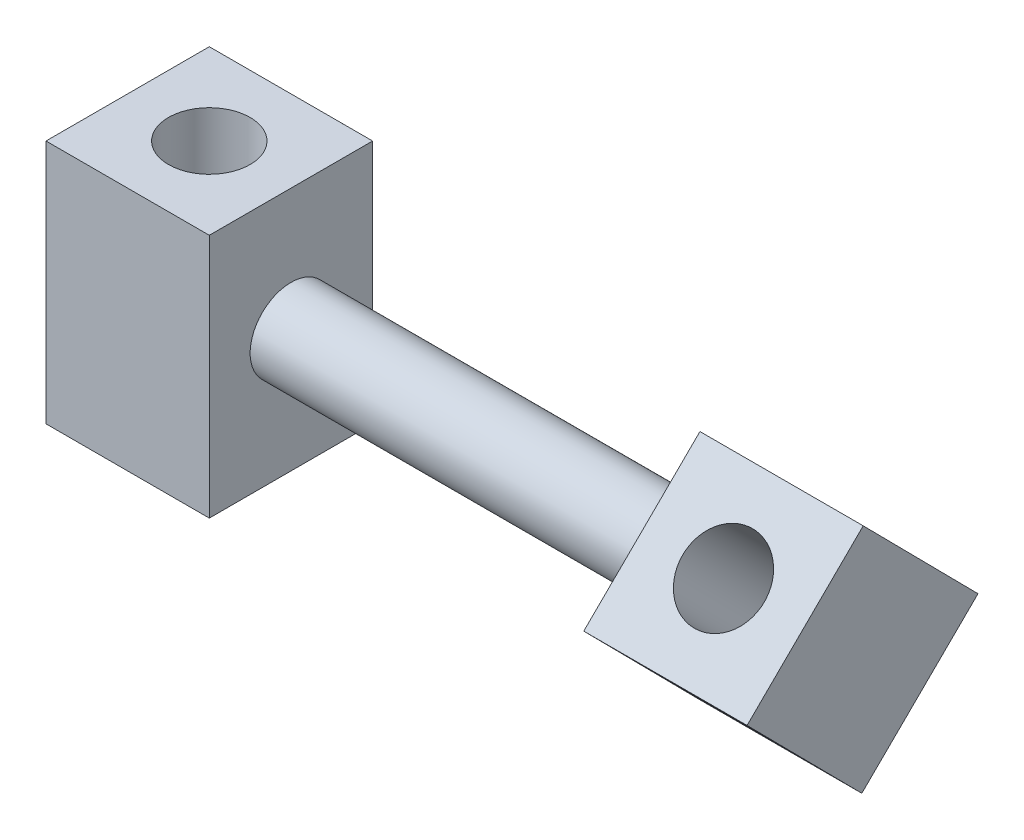
ISO-10303-21;
HEADER;
FILE_DESCRIPTION(('STEP AP214'),'2;1');
FILE_NAME('part.step','',(''),(''),'','','');
FILE_SCHEMA(('AUTOMOTIVE_DESIGN { 1 0 10303 214 1 1 1 1 }'));
ENDSEC;
DATA;
#1=APPLICATION_CONTEXT('core data for automotive mechanical design processes');
#2=APPLICATION_PROTOCOL_DEFINITION('international standard','automotive_design',2000,#1);
#3=PRODUCT_CONTEXT('',#1,'mechanical');
#4=PRODUCT('Part','Part','',(#3));
#5=PRODUCT_RELATED_PRODUCT_CATEGORY('part','',(#4));
#6=PRODUCT_DEFINITION_FORMATION('','',#4);
#7=PRODUCT_DEFINITION_CONTEXT('part definition',#1,'design');
#8=PRODUCT_DEFINITION('design','',#6,#7);
#9=PRODUCT_DEFINITION_SHAPE('','',#8);
#10=(LENGTH_UNIT() NAMED_UNIT(*) SI_UNIT(.MILLI.,.METRE.));
#11=(NAMED_UNIT(*) PLANE_ANGLE_UNIT() SI_UNIT($,.RADIAN.));
#12=(NAMED_UNIT(*) SI_UNIT($,.STERADIAN.) SOLID_ANGLE_UNIT());
#13=UNCERTAINTY_MEASURE_WITH_UNIT(LENGTH_MEASURE(1.E-05),#10,'distance_accuracy_value','');
#14=(GEOMETRIC_REPRESENTATION_CONTEXT(3) GLOBAL_UNCERTAINTY_ASSIGNED_CONTEXT((#13)) GLOBAL_UNIT_ASSIGNED_CONTEXT((#10,
#11,#12)) REPRESENTATION_CONTEXT('',''));
#15=CARTESIAN_POINT('',(0.,0.,0.));
#16=DIRECTION('',(0.,0.,1.));
#17=DIRECTION('',(1.,0.,0.));
#18=AXIS2_PLACEMENT_3D('',#15,#16,#17);
#19=CARTESIAN_POINT('',(10.,30.,10.));
#20=DIRECTION('',(-1.,0.,0.));
#21=DIRECTION('',(0.,0.,1.));
#22=AXIS2_PLACEMENT_3D('',#19,#20,#21);
#23=PLANE('',#22);
#24=CARTESIAN_POINT('',(10.,15.,0.));
#25=DIRECTION('',(1.,0.,0.));
#26=DIRECTION('',(0.,0.,-1.));
#27=AXIS2_PLACEMENT_3D('',#24,#25,#26);
#28=CIRCLE('',#27,5.);
#29=CARTESIAN_POINT('',(10.,15.,-5.));
#30=VERTEX_POINT('',#29);
#31=EDGE_CURVE('E11',#30,#30,#28,.T.);
#32=ORIENTED_EDGE('',*,*,#31,.F.);
#33=EDGE_LOOP('',(#32));
#34=FACE_BOUND('',#33,.T.);
#35=DIRECTION('',(0.,0.,-1.));
#36=VECTOR('',#35,1.);
#37=CARTESIAN_POINT('',(10.,0.,10.));
#38=LINE('',#37,#36);
#39=CARTESIAN_POINT('',(10.,0.,10.));
#40=VERTEX_POINT('',#39);
#41=CARTESIAN_POINT('',(10.,0.,-10.));
#42=VERTEX_POINT('',#41);
#43=EDGE_CURVE('E138',#40,#42,#38,.T.);
#44=ORIENTED_EDGE('',*,*,#43,.T.);
#45=DIRECTION('',(0.,-1.,0.));
#46=VECTOR('',#45,1.);
#47=CARTESIAN_POINT('',(10.,30.,-10.));
#48=LINE('',#47,#46);
#49=CARTESIAN_POINT('',(10.,30.,-10.));
#50=VERTEX_POINT('',#49);
#51=EDGE_CURVE('E37',#50,#42,#48,.T.);
#52=ORIENTED_EDGE('',*,*,#51,.F.);
#53=DIRECTION('',(0.,0.,-1.));
#54=VECTOR('',#53,1.);
#55=CARTESIAN_POINT('',(10.,30.,10.));
#56=LINE('',#55,#54);
#57=CARTESIAN_POINT('',(10.,30.,10.));
#58=VERTEX_POINT('',#57);
#59=EDGE_CURVE('E144',#58,#50,#56,.T.);
#60=ORIENTED_EDGE('',*,*,#59,.F.);
#61=DIRECTION('',(0.,-1.,0.));
#62=VECTOR('',#61,1.);
#63=CARTESIAN_POINT('',(10.,30.,10.));
#64=LINE('',#63,#62);
#65=EDGE_CURVE('E150',#58,#40,#64,.T.);
#66=ORIENTED_EDGE('',*,*,#65,.T.);
#67=EDGE_LOOP('',(#44,#52,#60,#66));
#68=FACE_BOUND('',#67,.T.);
#69=ADVANCED_FACE('F34',(#34,#68),#23,.F.);
#70=CARTESIAN_POINT('',(-10.,30.,-10.));
#71=DIRECTION('',(0.,0.,1.));
#72=DIRECTION('',(1.,0.,0.));
#73=AXIS2_PLACEMENT_3D('',#70,#71,#72);
#74=PLANE('',#73);
#75=DIRECTION('',(-1.,0.,0.));
#76=VECTOR('',#75,1.);
#77=CARTESIAN_POINT('',(-10.,0.,-10.));
#78=LINE('',#77,#76);
#79=CARTESIAN_POINT('',(-10.,0.,-10.));
#80=VERTEX_POINT('',#79);
#81=EDGE_CURVE('E153',#42,#80,#78,.T.);
#82=ORIENTED_EDGE('',*,*,#81,.T.);
#83=DIRECTION('',(0.,-1.,0.));
#84=VECTOR('',#83,1.);
#85=CARTESIAN_POINT('',(-10.,30.,-10.));
#86=LINE('',#85,#84);
#87=CARTESIAN_POINT('',(-10.,30.,-10.));
#88=VERTEX_POINT('',#87);
#89=EDGE_CURVE('E159',#88,#80,#86,.T.);
#90=ORIENTED_EDGE('',*,*,#89,.F.);
#91=DIRECTION('',(-1.,0.,0.));
#92=VECTOR('',#91,1.);
#93=CARTESIAN_POINT('',(-10.,30.,-10.));
#94=LINE('',#93,#92);
#95=EDGE_CURVE('E83',#50,#88,#94,.T.);
#96=ORIENTED_EDGE('',*,*,#95,.F.);
#97=ORIENTED_EDGE('',*,*,#51,.T.);
#98=EDGE_LOOP('',(#82,#90,#96,#97));
#99=FACE_BOUND('',#98,.T.);
#100=ADVANCED_FACE('F162',(#99),#74,.F.);
#101=CARTESIAN_POINT('',(-10.,30.,10.));
#102=DIRECTION('',(1.,0.,0.));
#103=DIRECTION('',(0.,0.,-1.));
#104=AXIS2_PLACEMENT_3D('',#101,#102,#103);
#105=PLANE('',#104);
#106=DIRECTION('',(0.,0.,1.));
#107=VECTOR('',#106,1.);
#108=CARTESIAN_POINT('',(-10.,0.,10.));
#109=LINE('',#108,#107);
#110=CARTESIAN_POINT('',(-10.,0.,10.));
#111=VERTEX_POINT('',#110);
#112=EDGE_CURVE('E69',#80,#111,#109,.T.);
#113=ORIENTED_EDGE('',*,*,#112,.T.);
#114=DIRECTION('',(0.,-1.,0.));
#115=VECTOR('',#114,1.);
#116=CARTESIAN_POINT('',(-10.,30.,10.));
#117=LINE('',#116,#115);
#118=CARTESIAN_POINT('',(-10.,30.,10.));
#119=VERTEX_POINT('',#118);
#120=EDGE_CURVE('E158',#119,#111,#117,.T.);
#121=ORIENTED_EDGE('',*,*,#120,.F.);
#122=DIRECTION('',(0.,0.,1.));
#123=VECTOR('',#122,1.);
#124=CARTESIAN_POINT('',(-10.,30.,10.));
#125=LINE('',#124,#123);
#126=EDGE_CURVE('E147',#88,#119,#125,.T.);
#127=ORIENTED_EDGE('',*,*,#126,.F.);
#128=ORIENTED_EDGE('',*,*,#89,.T.);
#129=EDGE_LOOP('',(#113,#121,#127,#128));
#130=FACE_BOUND('',#129,.T.);
#131=ADVANCED_FACE('F189',(#130),#105,.F.);
#132=CARTESIAN_POINT('',(-10.,30.,10.));
#133=DIRECTION('',(0.,0.,-1.));
#134=DIRECTION('',(-1.,0.,0.));
#135=AXIS2_PLACEMENT_3D('',#132,#133,#134);
#136=PLANE('',#135);
#137=DIRECTION('',(1.,0.,0.));
#138=VECTOR('',#137,1.);
#139=CARTESIAN_POINT('',(-10.,0.,10.));
#140=LINE('',#139,#138);
#141=EDGE_CURVE('E75',#111,#40,#140,.T.);
#142=ORIENTED_EDGE('',*,*,#141,.T.);
#143=ORIENTED_EDGE('',*,*,#65,.F.);
#144=DIRECTION('',(1.,0.,0.));
#145=VECTOR('',#144,1.);
#146=CARTESIAN_POINT('',(-10.,30.,10.));
#147=LINE('',#146,#145);
#148=EDGE_CURVE('E51',#119,#58,#147,.T.);
#149=ORIENTED_EDGE('',*,*,#148,.F.);
#150=ORIENTED_EDGE('',*,*,#120,.T.);
#151=EDGE_LOOP('',(#142,#143,#149,#150));
#152=FACE_BOUND('',#151,.T.);
#153=ADVANCED_FACE('F179',(#152),#136,.F.);
#154=CARTESIAN_POINT('',(0.,30.,0.));
#155=DIRECTION('',(0.,-1.,0.));
#156=DIRECTION('',(0.,0.,-1.));
#157=AXIS2_PLACEMENT_3D('',#154,#155,#156);
#158=PLANE('',#157);
#159=CARTESIAN_POINT('',(0.,30.,0.));
#160=DIRECTION('',(0.,1.,0.));
#161=DIRECTION('',(0.,0.,1.));
#162=AXIS2_PLACEMENT_3D('',#159,#160,#161);
#163=CIRCLE('',#162,5.);
#164=CARTESIAN_POINT('',(0.,30.,5.));
#165=VERTEX_POINT('',#164);
#166=EDGE_CURVE('E326',#165,#165,#163,.T.);
#167=ORIENTED_EDGE('',*,*,#166,.F.);
#168=EDGE_LOOP('',(#167));
#169=FACE_BOUND('',#168,.T.);
#170=ORIENTED_EDGE('',*,*,#59,.T.);
#171=ORIENTED_EDGE('',*,*,#95,.T.);
#172=ORIENTED_EDGE('',*,*,#126,.T.);
#173=ORIENTED_EDGE('',*,*,#148,.T.);
#174=EDGE_LOOP('',(#170,#171,#172,#173));
#175=FACE_BOUND('',#174,.T.);
#176=ADVANCED_FACE('F170',(#169,#175),#158,.F.);
#177=CARTESIAN_POINT('',(0.,0.,0.));
#178=DIRECTION('',(0.,-1.,0.));
#179=DIRECTION('',(0.,0.,-1.));
#180=AXIS2_PLACEMENT_3D('',#177,#178,#179);
#181=PLANE('',#180);
#182=CARTESIAN_POINT('',(0.,0.,0.));
#183=DIRECTION('',(0.,-1.,0.));
#184=DIRECTION('',(0.,0.,-1.));
#185=AXIS2_PLACEMENT_3D('',#182,#183,#184);
#186=CIRCLE('',#185,5.);
#187=CARTESIAN_POINT('',(0.,0.,-5.));
#188=VERTEX_POINT('',#187);
#189=EDGE_CURVE('E328',#188,#188,#186,.F.);
#190=ORIENTED_EDGE('',*,*,#189,.T.);
#191=EDGE_LOOP('',(#190));
#192=FACE_BOUND('',#191,.T.);
#193=ORIENTED_EDGE('',*,*,#43,.F.);
#194=ORIENTED_EDGE('',*,*,#141,.F.);
#195=ORIENTED_EDGE('',*,*,#112,.F.);
#196=ORIENTED_EDGE('',*,*,#81,.F.);
#197=EDGE_LOOP('',(#193,#194,#195,#196));
#198=FACE_BOUND('',#197,.T.);
#199=ADVANCED_FACE('F167',(#192,#198),#181,.T.);
#200=CARTESIAN_POINT('',(60.,15.,0.));
#201=DIRECTION('',(-1.,0.,0.));
#202=DIRECTION('',(0.,0.,1.));
#203=AXIS2_PLACEMENT_3D('',#200,#201,#202);
#204=CYLINDRICAL_SURFACE('',#203,5.);
#205=CARTESIAN_POINT('',(60.,15.,0.));
#206=DIRECTION('',(1.,0.,0.));
#207=DIRECTION('',(0.,0.,-1.));
#208=AXIS2_PLACEMENT_3D('',#205,#206,#207);
#209=CIRCLE('',#208,5.);
#210=CARTESIAN_POINT('',(60.,15.,-5.));
#211=VERTEX_POINT('',#210);
#212=EDGE_CURVE('E135',#211,#211,#209,.T.);
#213=ORIENTED_EDGE('',*,*,#212,.F.);
#214=EDGE_LOOP('',(#213));
#215=FACE_BOUND('',#214,.T.);
#216=ORIENTED_EDGE('',*,*,#31,.T.);
#217=EDGE_LOOP('',(#216));
#218=FACE_BOUND('',#217,.T.);
#219=ADVANCED_FACE('F169',(#215,#218),#204,.T.);
#220=CARTESIAN_POINT('',(80.,15.0855355460684,14.1418769500501));
#221=DIRECTION('',(0.,0.702817070199086,-0.711370624805926));
#222=DIRECTION('',(0.,0.711370624805926,0.702817070199086));
#223=AXIS2_PLACEMENT_3D('',#220,#221,#222);
#224=PLANE('',#223);
#225=DIRECTION('',(0.,-0.711370624805926,-0.702817070199086));
#226=VECTOR('',#225,1.);
#227=CARTESIAN_POINT('',(60.,15.0855355460684,14.1418769500501));
#228=LINE('',#227,#226);
#229=CARTESIAN_POINT('',(60.,15.0855355460684,14.1418769500501));
#230=VERTEX_POINT('',#229);
#231=CARTESIAN_POINT('',(60.,0.858123049949879,0.0855355460683983));
#232=VERTEX_POINT('',#231);
#233=EDGE_CURVE('E134',#230,#232,#228,.T.);
#234=ORIENTED_EDGE('',*,*,#233,.T.);
#235=DIRECTION('',(-1.,0.,0.));
#236=VECTOR('',#235,1.);
#237=CARTESIAN_POINT('',(80.,0.858123049949879,0.0855355460683983));
#238=LINE('',#237,#236);
#239=CARTESIAN_POINT('',(80.,0.858123049949879,0.0855355460683983));
#240=VERTEX_POINT('',#239);
#241=EDGE_CURVE('E114',#240,#232,#238,.T.);
#242=ORIENTED_EDGE('',*,*,#241,.F.);
#243=DIRECTION('',(0.,-0.711370624805926,-0.702817070199086));
#244=VECTOR('',#243,1.);
#245=CARTESIAN_POINT('',(80.,15.0855355460684,14.1418769500501));
#246=LINE('',#245,#244);
#247=CARTESIAN_POINT('',(80.,15.0855355460684,14.1418769500501));
#248=VERTEX_POINT('',#247);
#249=EDGE_CURVE('E121',#248,#240,#246,.T.);
#250=ORIENTED_EDGE('',*,*,#249,.F.);
#251=DIRECTION('',(-1.,0.,0.));
#252=VECTOR('',#251,1.);
#253=CARTESIAN_POINT('',(80.,15.0855355460684,14.1418769500501));
#254=LINE('',#253,#252);
#255=EDGE_CURVE('E319',#248,#230,#254,.T.);
#256=ORIENTED_EDGE('',*,*,#255,.T.);
#257=EDGE_LOOP('',(#234,#242,#250,#256));
#258=FACE_BOUND('',#257,.T.);
#259=ADVANCED_FACE('F132',(#258),#224,.F.);
#260=CARTESIAN_POINT('',(80.,0.858123049949879,0.0855355460683983));
#261=DIRECTION('',(0.,0.711370624805926,0.702817070199086));
#262=DIRECTION('',(0.,-0.702817070199086,0.711370624805926));
#263=AXIS2_PLACEMENT_3D('',#260,#261,#262);
#264=PLANE('',#263);
#265=CARTESIAN_POINT('',(70.,7.88629375194074,-7.02817070199086));
#266=DIRECTION('',(0.,0.711370624805926,0.702817070199086));
#267=DIRECTION('',(0.,-0.702817070199086,0.711370624805926));
#268=AXIS2_PLACEMENT_3D('',#265,#266,#267);
#269=CIRCLE('',#268,5.);
#270=CARTESIAN_POINT('',(70.,4.37220840094531,-3.47131757796123));
#271=VERTEX_POINT('',#270);
#272=EDGE_CURVE('E332',#271,#271,#269,.F.);
#273=ORIENTED_EDGE('',*,*,#272,.F.);
#274=EDGE_LOOP('',(#273));
#275=FACE_BOUND('',#274,.T.);
#276=DIRECTION('',(0.,0.702817070199086,-0.711370624805926));
#277=VECTOR('',#276,1.);
#278=CARTESIAN_POINT('',(60.,0.858123049949879,0.0855355460683983));
#279=LINE('',#278,#277);
#280=CARTESIAN_POINT('',(60.,14.9144644539316,-14.1418769500501));
#281=VERTEX_POINT('',#280);
#282=EDGE_CURVE('E316',#232,#281,#279,.T.);
#283=ORIENTED_EDGE('',*,*,#282,.T.);
#284=DIRECTION('',(-1.,0.,0.));
#285=VECTOR('',#284,1.);
#286=CARTESIAN_POINT('',(80.,14.9144644539316,-14.1418769500501));
#287=LINE('',#286,#285);
#288=CARTESIAN_POINT('',(80.,14.9144644539316,-14.1418769500501));
#289=VERTEX_POINT('',#288);
#290=EDGE_CURVE('E117',#289,#281,#287,.T.);
#291=ORIENTED_EDGE('',*,*,#290,.F.);
#292=DIRECTION('',(0.,0.702817070199086,-0.711370624805926));
#293=VECTOR('',#292,1.);
#294=CARTESIAN_POINT('',(80.,0.858123049949879,0.0855355460683983));
#295=LINE('',#294,#293);
#296=EDGE_CURVE('E110',#240,#289,#295,.T.);
#297=ORIENTED_EDGE('',*,*,#296,.F.);
#298=ORIENTED_EDGE('',*,*,#241,.T.);
#299=EDGE_LOOP('',(#283,#291,#297,#298));
#300=FACE_BOUND('',#299,.T.);
#301=ADVANCED_FACE('F112',(#275,#300),#264,.F.);
#302=CARTESIAN_POINT('',(80.,29.1418769500501,-0.0855355460683931));
#303=DIRECTION('',(0.,-0.702817070199086,0.711370624805926));
#304=DIRECTION('',(0.,-0.711370624805926,-0.702817070199086));
#305=AXIS2_PLACEMENT_3D('',#302,#303,#304);
#306=PLANE('',#305);
#307=DIRECTION('',(0.,0.711370624805926,0.702817070199086));
#308=VECTOR('',#307,1.);
#309=CARTESIAN_POINT('',(60.,29.1418769500501,-0.0855355460683931));
#310=LINE('',#309,#308);
#311=CARTESIAN_POINT('',(60.,29.1418769500501,-0.0855355460683931));
#312=VERTEX_POINT('',#311);
#313=EDGE_CURVE('E312',#281,#312,#310,.T.);
#314=ORIENTED_EDGE('',*,*,#313,.T.);
#315=DIRECTION('',(-1.,0.,0.));
#316=VECTOR('',#315,1.);
#317=CARTESIAN_POINT('',(80.,29.1418769500501,-0.0855355460683931));
#318=LINE('',#317,#316);
#319=CARTESIAN_POINT('',(80.,29.1418769500501,-0.0855355460683931));
#320=VERTEX_POINT('',#319);
#321=EDGE_CURVE('E140',#320,#312,#318,.T.);
#322=ORIENTED_EDGE('',*,*,#321,.F.);
#323=DIRECTION('',(0.,0.711370624805926,0.702817070199086));
#324=VECTOR('',#323,1.);
#325=CARTESIAN_POINT('',(80.,29.1418769500501,-0.0855355460683931));
#326=LINE('',#325,#324);
#327=EDGE_CURVE('E120',#289,#320,#326,.T.);
#328=ORIENTED_EDGE('',*,*,#327,.F.);
#329=ORIENTED_EDGE('',*,*,#290,.T.);
#330=EDGE_LOOP('',(#314,#322,#328,#329));
#331=FACE_BOUND('',#330,.T.);
#332=ADVANCED_FACE('F238',(#331),#306,.F.);
#333=CARTESIAN_POINT('',(80.,15.0855355460684,14.1418769500501));
#334=DIRECTION('',(0.,-0.711370624805925,-0.702817070199086));
#335=DIRECTION('',(0.,0.702817070199086,-0.711370624805925));
#336=AXIS2_PLACEMENT_3D('',#333,#334,#335);
#337=PLANE('',#336);
#338=CARTESIAN_POINT('',(70.,22.1137062480593,7.02817070199087));
#339=DIRECTION('',(0.,0.711370624805925,0.702817070199086));
#340=DIRECTION('',(0.,-0.702817070199086,0.711370624805925));
#341=AXIS2_PLACEMENT_3D('',#338,#339,#340);
#342=CIRCLE('',#341,5.);
#343=CARTESIAN_POINT('',(70.,18.5996208970638,10.5850238260205));
#344=VERTEX_POINT('',#343);
#345=EDGE_CURVE('E337',#344,#344,#342,.T.);
#346=ORIENTED_EDGE('',*,*,#345,.F.);
#347=EDGE_LOOP('',(#346));
#348=FACE_BOUND('',#347,.T.);
#349=DIRECTION('',(0.,-0.702817070199086,0.711370624805925));
#350=VECTOR('',#349,1.);
#351=CARTESIAN_POINT('',(60.,15.0855355460684,14.1418769500501));
#352=LINE('',#351,#350);
#353=EDGE_CURVE('E130',#312,#230,#352,.T.);
#354=ORIENTED_EDGE('',*,*,#353,.T.);
#355=ORIENTED_EDGE('',*,*,#255,.F.);
#356=DIRECTION('',(0.,-0.702817070199086,0.711370624805925));
#357=VECTOR('',#356,1.);
#358=CARTESIAN_POINT('',(80.,15.0855355460684,14.1418769500501));
#359=LINE('',#358,#357);
#360=EDGE_CURVE('E126',#320,#248,#359,.T.);
#361=ORIENTED_EDGE('',*,*,#360,.F.);
#362=ORIENTED_EDGE('',*,*,#321,.T.);
#363=EDGE_LOOP('',(#354,#355,#361,#362));
#364=FACE_BOUND('',#363,.T.);
#365=ADVANCED_FACE('F248',(#348,#364),#337,.F.);
#366=CARTESIAN_POINT('',(80.,0.,0.));
#367=DIRECTION('',(1.,0.,0.));
#368=DIRECTION('',(0.,0.,-1.));
#369=AXIS2_PLACEMENT_3D('',#366,#367,#368);
#370=PLANE('',#369);
#371=ORIENTED_EDGE('',*,*,#249,.T.);
#372=ORIENTED_EDGE('',*,*,#296,.T.);
#373=ORIENTED_EDGE('',*,*,#327,.T.);
#374=ORIENTED_EDGE('',*,*,#360,.T.);
#375=EDGE_LOOP('',(#371,#372,#373,#374));
#376=FACE_BOUND('',#375,.T.);
#377=ADVANCED_FACE('F124',(#376),#370,.T.);
#378=CARTESIAN_POINT('',(60.,0.,0.));
#379=DIRECTION('',(1.,0.,0.));
#380=DIRECTION('',(0.,0.,-1.));
#381=AXIS2_PLACEMENT_3D('',#378,#379,#380);
#382=PLANE('',#381);
#383=ORIENTED_EDGE('',*,*,#212,.T.);
#384=EDGE_LOOP('',(#383));
#385=FACE_BOUND('',#384,.T.);
#386=ORIENTED_EDGE('',*,*,#233,.F.);
#387=ORIENTED_EDGE('',*,*,#353,.F.);
#388=ORIENTED_EDGE('',*,*,#313,.F.);
#389=ORIENTED_EDGE('',*,*,#282,.F.);
#390=EDGE_LOOP('',(#386,#387,#388,#389));
#391=FACE_BOUND('',#390,.T.);
#392=ADVANCED_FACE('F211',(#385,#391),#382,.F.);
#393=CARTESIAN_POINT('',(0.,-0.001000000000001,0.));
#394=DIRECTION('',(0.,1.,0.));
#395=DIRECTION('',(0.,0.,1.));
#396=AXIS2_PLACEMENT_3D('',#393,#394,#395);
#397=CYLINDRICAL_SURFACE('',#396,5.);
#398=ORIENTED_EDGE('',*,*,#189,.F.);
#399=EDGE_LOOP('',(#398));
#400=FACE_BOUND('',#399,.T.);
#401=ORIENTED_EDGE('',*,*,#166,.T.);
#402=EDGE_LOOP('',(#401));
#403=FACE_BOUND('',#402,.T.);
#404=ADVANCED_FACE('F221',(#400,#403),#397,.F.);
#405=CARTESIAN_POINT('',(70.,0.337850359006717,-14.4858512485173));
#406=DIRECTION('',(0.,0.711370624805925,0.702817070199086));
#407=DIRECTION('',(0.,-0.702817070199086,0.711370624805925));
#408=AXIS2_PLACEMENT_3D('',#405,#406,#407);
#409=CYLINDRICAL_SURFACE('',#408,5.);
#410=ORIENTED_EDGE('',*,*,#345,.T.);
#411=EDGE_LOOP('',(#410));
#412=FACE_BOUND('',#411,.T.);
#413=ORIENTED_EDGE('',*,*,#272,.T.);
#414=EDGE_LOOP('',(#413));
#415=FACE_BOUND('',#414,.T.);
#416=ADVANCED_FACE('F226',(#412,#415),#409,.F.);
#417=CLOSED_SHELL('',(#69,#100,#131,#153,#176,#199,#219,#259,#301,#332,#365,#377,#392,#404,#416));
#418=MANIFOLD_SOLID_BREP('B2',#417);
#419=ADVANCED_BREP_SHAPE_REPRESENTATION('',(#18,#418),#14);
#420=SHAPE_DEFINITION_REPRESENTATION(#9,#419);
ENDSEC;
END-ISO-10303-21;
